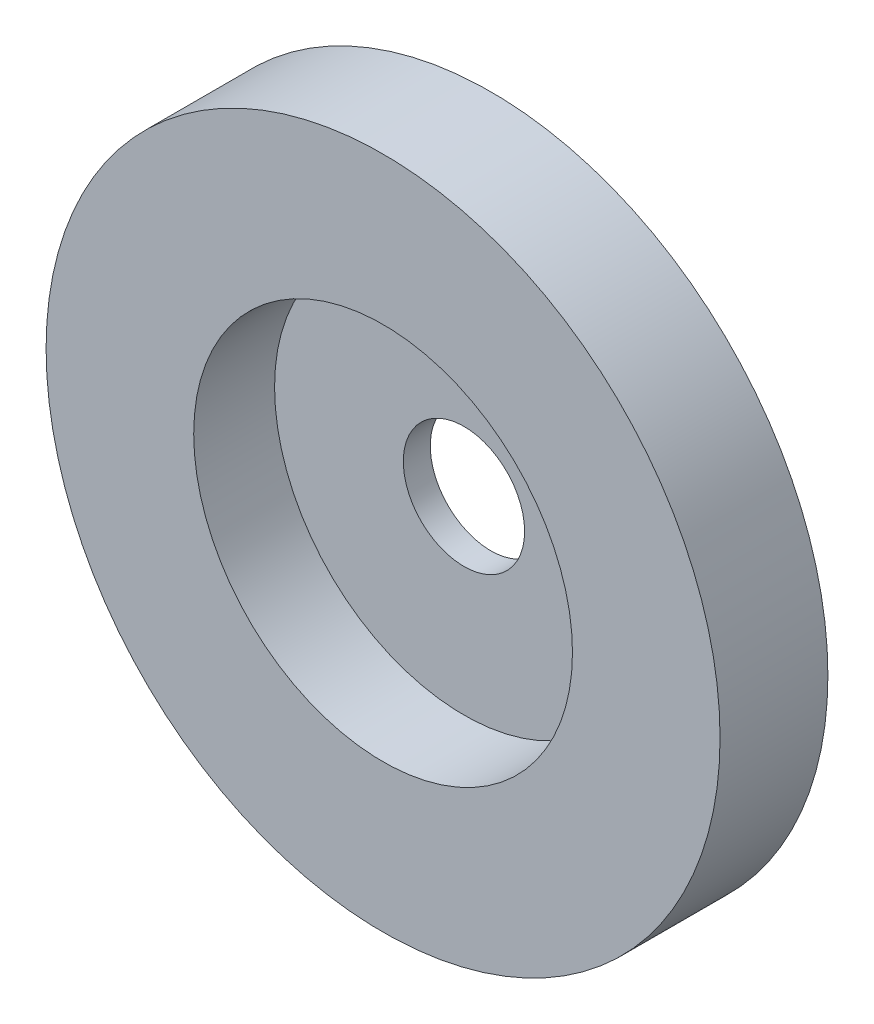
ISO-10303-21;
HEADER;
FILE_DESCRIPTION(('STEP AP214'),'2;1');
FILE_NAME('part.step','',(''),(''),'','','');
FILE_SCHEMA(('AUTOMOTIVE_DESIGN { 1 0 10303 214 1 1 1 1 }'));
ENDSEC;
DATA;
#1=APPLICATION_CONTEXT('core data for automotive mechanical design processes');
#2=APPLICATION_PROTOCOL_DEFINITION('international standard','automotive_design',2000,#1);
#3=PRODUCT_CONTEXT('',#1,'mechanical');
#4=PRODUCT('Part','Part','',(#3));
#5=PRODUCT_RELATED_PRODUCT_CATEGORY('part','',(#4));
#6=PRODUCT_DEFINITION_FORMATION('','',#4);
#7=PRODUCT_DEFINITION_CONTEXT('part definition',#1,'design');
#8=PRODUCT_DEFINITION('design','',#6,#7);
#9=PRODUCT_DEFINITION_SHAPE('','',#8);
#10=(LENGTH_UNIT() NAMED_UNIT(*) SI_UNIT(.MILLI.,.METRE.));
#11=(NAMED_UNIT(*) PLANE_ANGLE_UNIT() SI_UNIT($,.RADIAN.));
#12=(NAMED_UNIT(*) SI_UNIT($,.STERADIAN.) SOLID_ANGLE_UNIT());
#13=UNCERTAINTY_MEASURE_WITH_UNIT(LENGTH_MEASURE(1.E-05),#10,'distance_accuracy_value','');
#14=(GEOMETRIC_REPRESENTATION_CONTEXT(3) GLOBAL_UNCERTAINTY_ASSIGNED_CONTEXT((#13)) GLOBAL_UNIT_ASSIGNED_CONTEXT((#10,
#11,#12)) REPRESENTATION_CONTEXT('',''));
#15=CARTESIAN_POINT('',(0.,0.,0.));
#16=DIRECTION('',(0.,0.,1.));
#17=DIRECTION('',(1.,0.,0.));
#18=AXIS2_PLACEMENT_3D('',#15,#16,#17);
#19=CARTESIAN_POINT('',(0.,0.,8.));
#20=DIRECTION('',(0.,0.,-1.));
#21=DIRECTION('',(-1.,0.,0.));
#22=AXIS2_PLACEMENT_3D('',#19,#20,#21);
#23=CYLINDRICAL_SURFACE('',#22,25.);
#24=CARTESIAN_POINT('',(0.,0.,8.));
#25=DIRECTION('',(0.,0.,1.));
#26=DIRECTION('',(1.,0.,0.));
#27=AXIS2_PLACEMENT_3D('',#24,#25,#26);
#28=CIRCLE('',#27,25.);
#29=CARTESIAN_POINT('',(25.,0.,8.));
#30=VERTEX_POINT('',#29);
#31=EDGE_CURVE('E10',#30,#30,#28,.T.);
#32=ORIENTED_EDGE('',*,*,#31,.F.);
#33=EDGE_LOOP('',(#32));
#34=FACE_BOUND('',#33,.T.);
#35=CARTESIAN_POINT('',(0.,0.,0.));
#36=DIRECTION('',(0.,0.,1.));
#37=DIRECTION('',(1.,0.,0.));
#38=AXIS2_PLACEMENT_3D('',#35,#36,#37);
#39=CIRCLE('',#38,25.);
#40=CARTESIAN_POINT('',(25.,0.,0.));
#41=VERTEX_POINT('',#40);
#42=EDGE_CURVE('E47',#41,#41,#39,.T.);
#43=ORIENTED_EDGE('',*,*,#42,.T.);
#44=EDGE_LOOP('',(#43));
#45=FACE_BOUND('',#44,.T.);
#46=ADVANCED_FACE('F39',(#34,#45),#23,.T.);
#47=CARTESIAN_POINT('',(0.,0.,8.));
#48=DIRECTION('',(0.,0.,1.));
#49=DIRECTION('',(1.,0.,0.));
#50=AXIS2_PLACEMENT_3D('',#47,#48,#49);
#51=PLANE('',#50);
#52=CARTESIAN_POINT('',(0.,0.,8.));
#53=DIRECTION('',(0.,0.,1.));
#54=DIRECTION('',(1.,0.,0.));
#55=AXIS2_PLACEMENT_3D('',#52,#53,#54);
#56=CIRCLE('',#55,14.05);
#57=CARTESIAN_POINT('',(14.05,0.,8.));
#58=VERTEX_POINT('',#57);
#59=EDGE_CURVE('E55',#58,#58,#56,.T.);
#60=ORIENTED_EDGE('',*,*,#59,.F.);
#61=EDGE_LOOP('',(#60));
#62=FACE_BOUND('',#61,.T.);
#63=ORIENTED_EDGE('',*,*,#31,.T.);
#64=EDGE_LOOP('',(#63));
#65=FACE_BOUND('',#64,.T.);
#66=ADVANCED_FACE('F84',(#62,#65),#51,.T.);
#67=CARTESIAN_POINT('',(0.,0.,0.));
#68=DIRECTION('',(0.,0.,1.));
#69=DIRECTION('',(1.,0.,0.));
#70=AXIS2_PLACEMENT_3D('',#67,#68,#69);
#71=PLANE('',#70);
#72=CARTESIAN_POINT('',(0.,0.,0.));
#73=DIRECTION('',(0.,0.,1.));
#74=DIRECTION('',(1.,0.,0.));
#75=AXIS2_PLACEMENT_3D('',#72,#73,#74);
#76=CIRCLE('',#75,4.5);
#77=CARTESIAN_POINT('',(4.5,0.,0.));
#78=VERTEX_POINT('',#77);
#79=EDGE_CURVE('E62',#78,#78,#76,.T.);
#80=ORIENTED_EDGE('',*,*,#79,.T.);
#81=EDGE_LOOP('',(#80));
#82=FACE_BOUND('',#81,.T.);
#83=ORIENTED_EDGE('',*,*,#42,.F.);
#84=EDGE_LOOP('',(#83));
#85=FACE_BOUND('',#84,.T.);
#86=ADVANCED_FACE('F89',(#82,#85),#71,.F.);
#87=CARTESIAN_POINT('',(0.,0.,2.));
#88=DIRECTION('',(0.,0.,1.));
#89=DIRECTION('',(1.,0.,0.));
#90=AXIS2_PLACEMENT_3D('',#87,#88,#89);
#91=CYLINDRICAL_SURFACE('',#90,14.05);
#92=CARTESIAN_POINT('',(0.,0.,2.));
#93=DIRECTION('',(0.,0.,1.));
#94=DIRECTION('',(1.,0.,0.));
#95=AXIS2_PLACEMENT_3D('',#92,#93,#94);
#96=CIRCLE('',#95,14.05);
#97=CARTESIAN_POINT('',(14.05,0.,2.));
#98=VERTEX_POINT('',#97);
#99=EDGE_CURVE('E53',#98,#98,#96,.T.);
#100=ORIENTED_EDGE('',*,*,#99,.F.);
#101=EDGE_LOOP('',(#100));
#102=FACE_BOUND('',#101,.T.);
#103=ORIENTED_EDGE('',*,*,#59,.T.);
#104=EDGE_LOOP('',(#103));
#105=FACE_BOUND('',#104,.T.);
#106=ADVANCED_FACE('F81',(#102,#105),#91,.F.);
#107=CARTESIAN_POINT('',(0.,0.,2.));
#108=DIRECTION('',(0.,0.,1.));
#109=DIRECTION('',(1.,0.,0.));
#110=AXIS2_PLACEMENT_3D('',#107,#108,#109);
#111=PLANE('',#110);
#112=CARTESIAN_POINT('',(0.,0.,2.));
#113=DIRECTION('',(0.,0.,1.));
#114=DIRECTION('',(1.,0.,0.));
#115=AXIS2_PLACEMENT_3D('',#112,#113,#114);
#116=CIRCLE('',#115,4.5);
#117=CARTESIAN_POINT('',(4.5,0.,2.));
#118=VERTEX_POINT('',#117);
#119=EDGE_CURVE('E42',#118,#118,#116,.F.);
#120=ORIENTED_EDGE('',*,*,#119,.T.);
#121=EDGE_LOOP('',(#120));
#122=FACE_BOUND('',#121,.T.);
#123=ORIENTED_EDGE('',*,*,#99,.T.);
#124=EDGE_LOOP('',(#123));
#125=FACE_BOUND('',#124,.T.);
#126=ADVANCED_FACE('F71',(#122,#125),#111,.T.);
#127=CARTESIAN_POINT('',(0.,0.,11.5));
#128=DIRECTION('',(0.,0.,-1.));
#129=DIRECTION('',(-1.,0.,0.));
#130=AXIS2_PLACEMENT_3D('',#127,#128,#129);
#131=CYLINDRICAL_SURFACE('',#130,4.5);
#132=ORIENTED_EDGE('',*,*,#119,.F.);
#133=EDGE_LOOP('',(#132));
#134=FACE_BOUND('',#133,.T.);
#135=ORIENTED_EDGE('',*,*,#79,.F.);
#136=EDGE_LOOP('',(#135));
#137=FACE_BOUND('',#136,.T.);
#138=ADVANCED_FACE('F74',(#134,#137),#131,.F.);
#139=CLOSED_SHELL('',(#46,#66,#86,#106,#126,#138));
#140=MANIFOLD_SOLID_BREP('B2',#139);
#141=ADVANCED_BREP_SHAPE_REPRESENTATION('',(#18,#140),#14);
#142=SHAPE_DEFINITION_REPRESENTATION(#9,#141);
ENDSEC;
END-ISO-10303-21;
